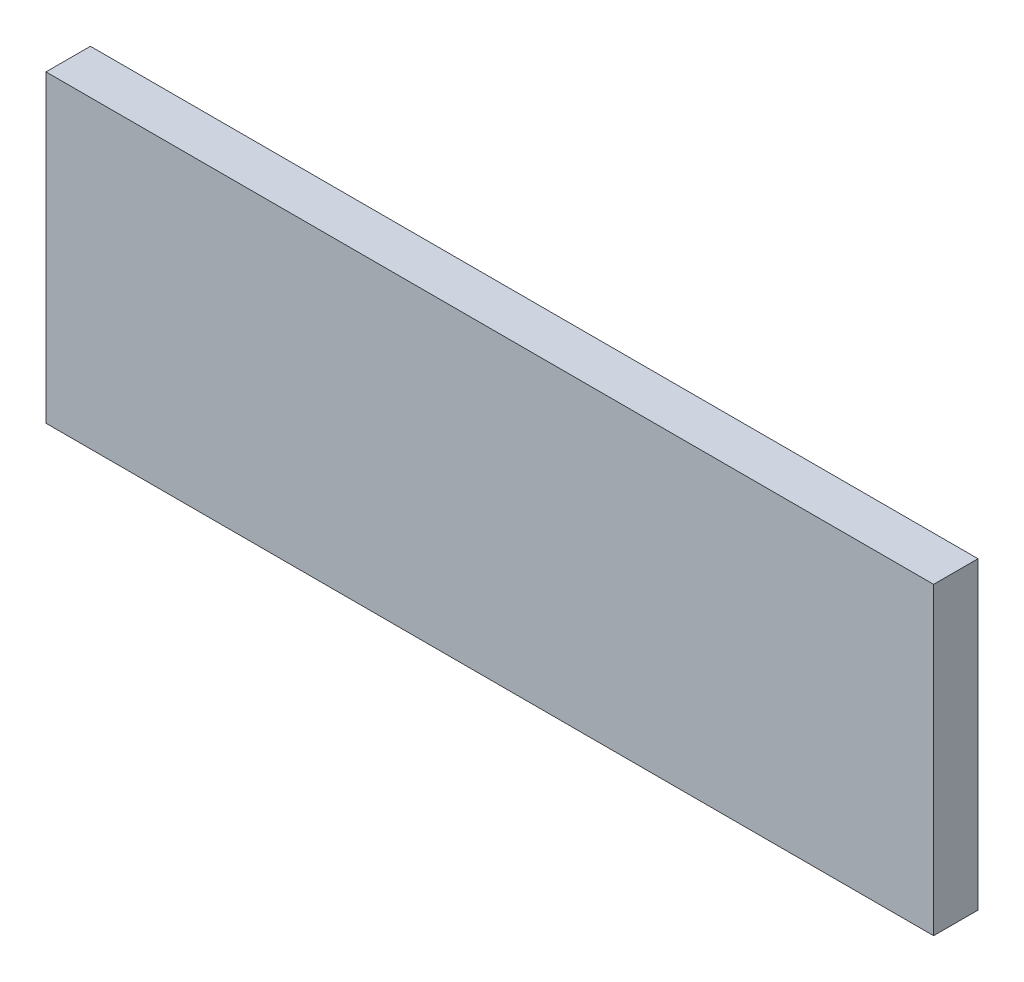
ISO-10303-21;
HEADER;
FILE_DESCRIPTION(('STEP AP214'),'2;1');
FILE_NAME('part.step','',(''),(''),'','','');
FILE_SCHEMA(('AUTOMOTIVE_DESIGN { 1 0 10303 214 1 1 1 1 }'));
ENDSEC;
DATA;
#1=APPLICATION_CONTEXT('core data for automotive mechanical design processes');
#2=APPLICATION_PROTOCOL_DEFINITION('international standard','automotive_design',2000,#1);
#3=PRODUCT_CONTEXT('',#1,'mechanical');
#4=PRODUCT('Part','Part','',(#3));
#5=PRODUCT_RELATED_PRODUCT_CATEGORY('part','',(#4));
#6=PRODUCT_DEFINITION_FORMATION('','',#4);
#7=PRODUCT_DEFINITION_CONTEXT('part definition',#1,'design');
#8=PRODUCT_DEFINITION('design','',#6,#7);
#9=PRODUCT_DEFINITION_SHAPE('','',#8);
#10=(LENGTH_UNIT() NAMED_UNIT(*) SI_UNIT(.MILLI.,.METRE.));
#11=(NAMED_UNIT(*) PLANE_ANGLE_UNIT() SI_UNIT($,.RADIAN.));
#12=(NAMED_UNIT(*) SI_UNIT($,.STERADIAN.) SOLID_ANGLE_UNIT());
#13=UNCERTAINTY_MEASURE_WITH_UNIT(LENGTH_MEASURE(1.E-05),#10,'distance_accuracy_value','');
#14=(GEOMETRIC_REPRESENTATION_CONTEXT(3) GLOBAL_UNCERTAINTY_ASSIGNED_CONTEXT((#13)) GLOBAL_UNIT_ASSIGNED_CONTEXT((#10,
#11,#12)) REPRESENTATION_CONTEXT('',''));
#15=CARTESIAN_POINT('',(0.,0.,0.));
#16=DIRECTION('',(0.,0.,1.));
#17=DIRECTION('',(1.,0.,0.));
#18=AXIS2_PLACEMENT_3D('',#15,#16,#17);
#19=CARTESIAN_POINT('',(0.,0.,1.75));
#20=DIRECTION('',(1.,0.,0.));
#21=DIRECTION('',(0.,0.,-1.));
#22=AXIS2_PLACEMENT_3D('',#19,#20,#21);
#23=PLANE('',#22);
#24=DIRECTION('',(0.,-1.,0.));
#25=VECTOR('',#24,1.);
#26=CARTESIAN_POINT('',(0.,0.,0.));
#27=LINE('',#26,#25);
#28=CARTESIAN_POINT('',(0.,12.,0.));
#29=VERTEX_POINT('',#28);
#30=CARTESIAN_POINT('',(0.,0.,0.));
#31=VERTEX_POINT('',#30);
#32=EDGE_CURVE('E101',#29,#31,#27,.T.);
#33=ORIENTED_EDGE('',*,*,#32,.T.);
#34=DIRECTION('',(0.,0.,-1.));
#35=VECTOR('',#34,1.);
#36=CARTESIAN_POINT('',(0.,0.,1.75));
#37=LINE('',#36,#35);
#38=CARTESIAN_POINT('',(0.,0.,1.75));
#39=VERTEX_POINT('',#38);
#40=EDGE_CURVE('E11',#39,#31,#37,.T.);
#41=ORIENTED_EDGE('',*,*,#40,.F.);
#42=DIRECTION('',(0.,-1.,0.));
#43=VECTOR('',#42,1.);
#44=CARTESIAN_POINT('',(0.,0.,1.75));
#45=LINE('',#44,#43);
#46=CARTESIAN_POINT('',(0.,12.,1.75));
#47=VERTEX_POINT('',#46);
#48=EDGE_CURVE('E89',#47,#39,#45,.T.);
#49=ORIENTED_EDGE('',*,*,#48,.F.);
#50=DIRECTION('',(0.,0.,-1.));
#51=VECTOR('',#50,1.);
#52=CARTESIAN_POINT('',(0.,12.,1.75));
#53=LINE('',#52,#51);
#54=EDGE_CURVE('E97',#47,#29,#53,.T.);
#55=ORIENTED_EDGE('',*,*,#54,.T.);
#56=EDGE_LOOP('',(#33,#41,#49,#55));
#57=FACE_BOUND('',#56,.T.);
#58=ADVANCED_FACE('F38',(#57),#23,.F.);
#59=CARTESIAN_POINT('',(0.,0.,1.75));
#60=DIRECTION('',(0.,1.,0.));
#61=DIRECTION('',(0.,0.,1.));
#62=AXIS2_PLACEMENT_3D('',#59,#60,#61);
#63=PLANE('',#62);
#64=DIRECTION('',(1.,0.,0.));
#65=VECTOR('',#64,1.);
#66=CARTESIAN_POINT('',(0.,0.,0.));
#67=LINE('',#66,#65);
#68=CARTESIAN_POINT('',(35.,0.,0.));
#69=VERTEX_POINT('',#68);
#70=EDGE_CURVE('E93',#31,#69,#67,.T.);
#71=ORIENTED_EDGE('',*,*,#70,.T.);
#72=DIRECTION('',(0.,0.,-1.));
#73=VECTOR('',#72,1.);
#74=CARTESIAN_POINT('',(35.,0.,1.75));
#75=LINE('',#74,#73);
#76=CARTESIAN_POINT('',(35.,0.,1.75));
#77=VERTEX_POINT('',#76);
#78=EDGE_CURVE('E46',#77,#69,#75,.T.);
#79=ORIENTED_EDGE('',*,*,#78,.F.);
#80=DIRECTION('',(1.,0.,0.));
#81=VECTOR('',#80,1.);
#82=CARTESIAN_POINT('',(0.,0.,1.75));
#83=LINE('',#82,#81);
#84=EDGE_CURVE('E84',#39,#77,#83,.T.);
#85=ORIENTED_EDGE('',*,*,#84,.F.);
#86=ORIENTED_EDGE('',*,*,#40,.T.);
#87=EDGE_LOOP('',(#71,#79,#85,#86));
#88=FACE_BOUND('',#87,.T.);
#89=ADVANCED_FACE('F92',(#88),#63,.F.);
#90=CARTESIAN_POINT('',(35.,0.,1.75));
#91=DIRECTION('',(-1.,0.,0.));
#92=DIRECTION('',(0.,0.,1.));
#93=AXIS2_PLACEMENT_3D('',#90,#91,#92);
#94=PLANE('',#93);
#95=DIRECTION('',(0.,1.,0.));
#96=VECTOR('',#95,1.);
#97=CARTESIAN_POINT('',(35.,0.,0.));
#98=LINE('',#97,#96);
#99=CARTESIAN_POINT('',(35.,12.,0.));
#100=VERTEX_POINT('',#99);
#101=EDGE_CURVE('E71',#69,#100,#98,.T.);
#102=ORIENTED_EDGE('',*,*,#101,.T.);
#103=DIRECTION('',(0.,0.,-1.));
#104=VECTOR('',#103,1.);
#105=CARTESIAN_POINT('',(35.,12.,1.75));
#106=LINE('',#105,#104);
#107=CARTESIAN_POINT('',(35.,12.,1.75));
#108=VERTEX_POINT('',#107);
#109=EDGE_CURVE('E94',#108,#100,#106,.T.);
#110=ORIENTED_EDGE('',*,*,#109,.F.);
#111=DIRECTION('',(0.,1.,0.));
#112=VECTOR('',#111,1.);
#113=CARTESIAN_POINT('',(35.,0.,1.75));
#114=LINE('',#113,#112);
#115=EDGE_CURVE('E87',#77,#108,#114,.T.);
#116=ORIENTED_EDGE('',*,*,#115,.F.);
#117=ORIENTED_EDGE('',*,*,#78,.T.);
#118=EDGE_LOOP('',(#102,#110,#116,#117));
#119=FACE_BOUND('',#118,.T.);
#120=ADVANCED_FACE('F95',(#119),#94,.F.);
#121=CARTESIAN_POINT('',(0.,12.,1.75));
#122=DIRECTION('',(0.,-1.,0.));
#123=DIRECTION('',(0.,0.,-1.));
#124=AXIS2_PLACEMENT_3D('',#121,#122,#123);
#125=PLANE('',#124);
#126=DIRECTION('',(-1.,0.,0.));
#127=VECTOR('',#126,1.);
#128=CARTESIAN_POINT('',(0.,12.,0.));
#129=LINE('',#128,#127);
#130=EDGE_CURVE('E77',#100,#29,#129,.T.);
#131=ORIENTED_EDGE('',*,*,#130,.T.);
#132=ORIENTED_EDGE('',*,*,#54,.F.);
#133=DIRECTION('',(-1.,0.,0.));
#134=VECTOR('',#133,1.);
#135=CARTESIAN_POINT('',(0.,12.,1.75));
#136=LINE('',#135,#134);
#137=EDGE_CURVE('E54',#108,#47,#136,.T.);
#138=ORIENTED_EDGE('',*,*,#137,.F.);
#139=ORIENTED_EDGE('',*,*,#109,.T.);
#140=EDGE_LOOP('',(#131,#132,#138,#139));
#141=FACE_BOUND('',#140,.T.);
#142=ADVANCED_FACE('F108',(#141),#125,.F.);
#143=CARTESIAN_POINT('',(0.,0.,1.75));
#144=DIRECTION('',(0.,0.,-1.));
#145=DIRECTION('',(-1.,0.,0.));
#146=AXIS2_PLACEMENT_3D('',#143,#144,#145);
#147=PLANE('',#146);
#148=ORIENTED_EDGE('',*,*,#48,.T.);
#149=ORIENTED_EDGE('',*,*,#84,.T.);
#150=ORIENTED_EDGE('',*,*,#115,.T.);
#151=ORIENTED_EDGE('',*,*,#137,.T.);
#152=EDGE_LOOP('',(#148,#149,#150,#151));
#153=FACE_BOUND('',#152,.T.);
#154=ADVANCED_FACE('F85',(#153),#147,.F.);
#155=CARTESIAN_POINT('',(0.,0.,0.));
#156=DIRECTION('',(0.,0.,-1.));
#157=DIRECTION('',(-1.,0.,0.));
#158=AXIS2_PLACEMENT_3D('',#155,#156,#157);
#159=PLANE('',#158);
#160=ORIENTED_EDGE('',*,*,#32,.F.);
#161=ORIENTED_EDGE('',*,*,#130,.F.);
#162=ORIENTED_EDGE('',*,*,#101,.F.);
#163=ORIENTED_EDGE('',*,*,#70,.F.);
#164=EDGE_LOOP('',(#160,#161,#162,#163));
#165=FACE_BOUND('',#164,.T.);
#166=ADVANCED_FACE('F111',(#165),#159,.T.);
#167=CLOSED_SHELL('',(#58,#89,#120,#142,#154,#166));
#168=MANIFOLD_SOLID_BREP('B2',#167);
#169=ADVANCED_BREP_SHAPE_REPRESENTATION('',(#18,#168),#14);
#170=SHAPE_DEFINITION_REPRESENTATION(#9,#169);
ENDSEC;
END-ISO-10303-21;
